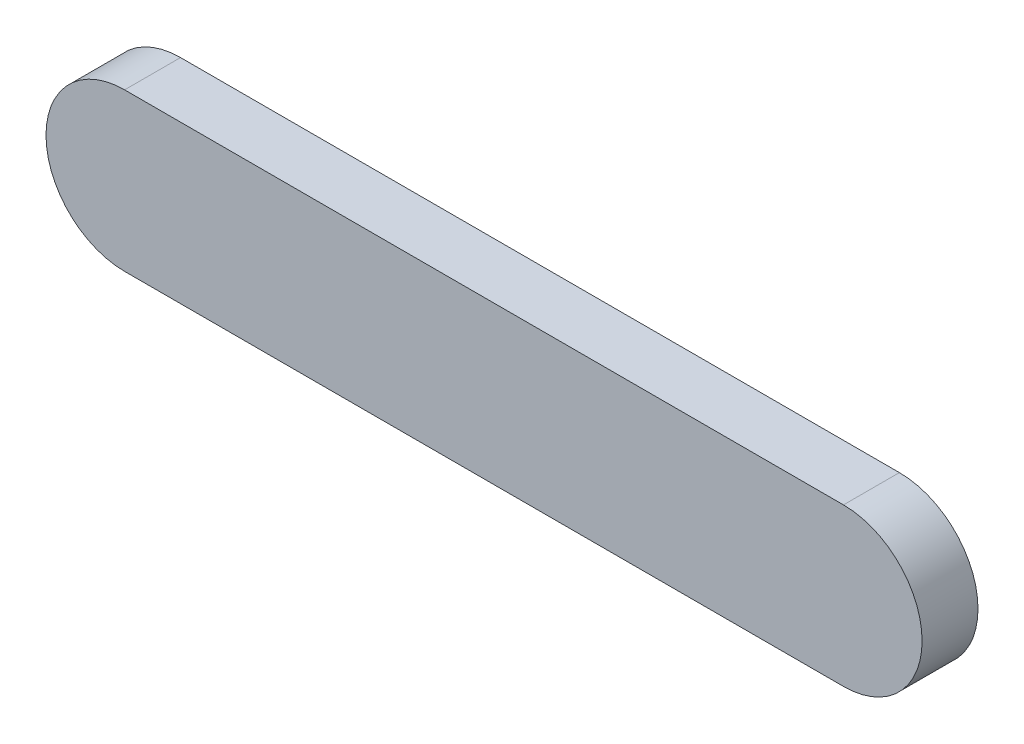
ISO-10303-21;
HEADER;
FILE_DESCRIPTION(('STEP AP214'),'2;1');
FILE_NAME('part.step','',(''),(''),'','','');
FILE_SCHEMA(('AUTOMOTIVE_DESIGN { 1 0 10303 214 1 1 1 1 }'));
ENDSEC;
DATA;
#1=APPLICATION_CONTEXT('core data for automotive mechanical design processes');
#2=APPLICATION_PROTOCOL_DEFINITION('international standard','automotive_design',2000,#1);
#3=PRODUCT_CONTEXT('',#1,'mechanical');
#4=PRODUCT('Part','Part','',(#3));
#5=PRODUCT_RELATED_PRODUCT_CATEGORY('part','',(#4));
#6=PRODUCT_DEFINITION_FORMATION('','',#4);
#7=PRODUCT_DEFINITION_CONTEXT('part definition',#1,'design');
#8=PRODUCT_DEFINITION('design','',#6,#7);
#9=PRODUCT_DEFINITION_SHAPE('','',#8);
#10=(LENGTH_UNIT() NAMED_UNIT(*) SI_UNIT(.MILLI.,.METRE.));
#11=(NAMED_UNIT(*) PLANE_ANGLE_UNIT() SI_UNIT($,.RADIAN.));
#12=(NAMED_UNIT(*) SI_UNIT($,.STERADIAN.) SOLID_ANGLE_UNIT());
#13=UNCERTAINTY_MEASURE_WITH_UNIT(LENGTH_MEASURE(1.E-05),#10,'distance_accuracy_value','');
#14=(GEOMETRIC_REPRESENTATION_CONTEXT(3) GLOBAL_UNCERTAINTY_ASSIGNED_CONTEXT((#13)) GLOBAL_UNIT_ASSIGNED_CONTEXT((#10,
#11,#12)) REPRESENTATION_CONTEXT('',''));
#15=CARTESIAN_POINT('',(0.,0.,0.));
#16=DIRECTION('',(0.,0.,1.));
#17=DIRECTION('',(1.,0.,0.));
#18=AXIS2_PLACEMENT_3D('',#15,#16,#17);
#19=CARTESIAN_POINT('',(-37.9019976077163,107.832873361256,-12.954));
#20=DIRECTION('',(0.,0.,1.));
#21=DIRECTION('',(1.,0.,0.));
#22=AXIS2_PLACEMENT_3D('',#19,#20,#21);
#23=CYLINDRICAL_SURFACE('',#22,25.);
#24=CARTESIAN_POINT('',(-37.9019976077163,107.832873361256,4.826));
#25=DIRECTION('',(0.,0.,1.));
#26=DIRECTION('',(1.,0.,0.));
#27=AXIS2_PLACEMENT_3D('',#24,#25,#26);
#28=CIRCLE('',#27,25.);
#29=CARTESIAN_POINT('',(-37.9019976077163,82.8328733612559,4.826));
#30=VERTEX_POINT('',#29);
#31=CARTESIAN_POINT('',(-37.9019976077163,132.832873361256,4.826));
#32=VERTEX_POINT('',#31);
#33=EDGE_CURVE('E98',#30,#32,#28,.T.);
#34=ORIENTED_EDGE('',*,*,#33,.F.);
#35=DIRECTION('',(0.,0.,1.));
#36=VECTOR('',#35,1.);
#37=CARTESIAN_POINT('',(-37.9019976077163,82.8328733612559,-12.954));
#38=LINE('',#37,#36);
#39=CARTESIAN_POINT('',(-37.9019976077163,82.8328733612559,-12.954));
#40=VERTEX_POINT('',#39);
#41=EDGE_CURVE('E11',#40,#30,#38,.T.);
#42=ORIENTED_EDGE('',*,*,#41,.F.);
#43=CARTESIAN_POINT('',(-37.9019976077163,107.832873361256,-12.954));
#44=DIRECTION('',(0.,0.,1.));
#45=DIRECTION('',(1.,0.,0.));
#46=AXIS2_PLACEMENT_3D('',#43,#44,#45);
#47=CIRCLE('',#46,25.);
#48=CARTESIAN_POINT('',(-37.9019976077163,132.832873361256,-12.954));
#49=VERTEX_POINT('',#48);
#50=EDGE_CURVE('E92',#40,#49,#47,.T.);
#51=ORIENTED_EDGE('',*,*,#50,.T.);
#52=DIRECTION('',(0.,0.,1.));
#53=VECTOR('',#52,1.);
#54=CARTESIAN_POINT('',(-37.9019976077163,132.832873361256,-12.954));
#55=LINE('',#54,#53);
#56=EDGE_CURVE('E37',#49,#32,#55,.T.);
#57=ORIENTED_EDGE('',*,*,#56,.T.);
#58=EDGE_LOOP('',(#34,#42,#51,#57));
#59=FACE_BOUND('',#58,.T.);
#60=ADVANCED_FACE('F34',(#59),#23,.T.);
#61=CARTESIAN_POINT('',(-266.501997607716,82.8328733612559,-12.954));
#62=DIRECTION('',(0.,-1.,0.));
#63=DIRECTION('',(1.,0.,0.));
#64=AXIS2_PLACEMENT_3D('',#61,#62,#63);
#65=PLANE('',#64);
#66=DIRECTION('',(1.,0.,0.));
#67=VECTOR('',#66,1.);
#68=CARTESIAN_POINT('',(-266.501997607716,82.8328733612559,4.826));
#69=LINE('',#68,#67);
#70=CARTESIAN_POINT('',(-266.501997607716,82.8328733612559,4.826));
#71=VERTEX_POINT('',#70);
#72=EDGE_CURVE('E94',#71,#30,#69,.T.);
#73=ORIENTED_EDGE('',*,*,#72,.F.);
#74=DIRECTION('',(0.,0.,1.));
#75=VECTOR('',#74,1.);
#76=CARTESIAN_POINT('',(-266.501997607716,82.8328733612559,-12.954));
#77=LINE('',#76,#75);
#78=CARTESIAN_POINT('',(-266.501997607716,82.8328733612559,-12.954));
#79=VERTEX_POINT('',#78);
#80=EDGE_CURVE('E43',#79,#71,#77,.T.);
#81=ORIENTED_EDGE('',*,*,#80,.F.);
#82=DIRECTION('',(1.,0.,0.));
#83=VECTOR('',#82,1.);
#84=CARTESIAN_POINT('',(-266.501997607716,82.8328733612559,-12.954));
#85=LINE('',#84,#83);
#86=EDGE_CURVE('E89',#79,#40,#85,.T.);
#87=ORIENTED_EDGE('',*,*,#86,.T.);
#88=ORIENTED_EDGE('',*,*,#41,.T.);
#89=EDGE_LOOP('',(#73,#81,#87,#88));
#90=FACE_BOUND('',#89,.T.);
#91=ADVANCED_FACE('F108',(#90),#65,.T.);
#92=CARTESIAN_POINT('',(-266.501997607716,107.832873361256,-12.954));
#93=DIRECTION('',(0.,0.,1.));
#94=DIRECTION('',(1.,0.,0.));
#95=AXIS2_PLACEMENT_3D('',#92,#93,#94);
#96=CYLINDRICAL_SURFACE('',#95,25.);
#97=CARTESIAN_POINT('',(-266.501997607716,107.832873361256,4.826));
#98=DIRECTION('',(0.,0.,1.));
#99=DIRECTION('',(-1.,0.,0.));
#100=AXIS2_PLACEMENT_3D('',#97,#98,#99);
#101=CIRCLE('',#100,25.);
#102=CARTESIAN_POINT('',(-266.501997607716,132.832873361256,4.826));
#103=VERTEX_POINT('',#102);
#104=EDGE_CURVE('E84',#103,#71,#101,.T.);
#105=ORIENTED_EDGE('',*,*,#104,.F.);
#106=DIRECTION('',(0.,0.,1.));
#107=VECTOR('',#106,1.);
#108=CARTESIAN_POINT('',(-266.501997607716,132.832873361256,-12.954));
#109=LINE('',#108,#107);
#110=CARTESIAN_POINT('',(-266.501997607716,132.832873361256,-12.954));
#111=VERTEX_POINT('',#110);
#112=EDGE_CURVE('E79',#111,#103,#109,.T.);
#113=ORIENTED_EDGE('',*,*,#112,.F.);
#114=CARTESIAN_POINT('',(-266.501997607716,107.832873361256,-12.954));
#115=DIRECTION('',(0.,0.,1.));
#116=DIRECTION('',(-1.,0.,0.));
#117=AXIS2_PLACEMENT_3D('',#114,#115,#116);
#118=CIRCLE('',#117,25.);
#119=EDGE_CURVE('E82',#111,#79,#118,.T.);
#120=ORIENTED_EDGE('',*,*,#119,.T.);
#121=ORIENTED_EDGE('',*,*,#80,.T.);
#122=EDGE_LOOP('',(#105,#113,#120,#121));
#123=FACE_BOUND('',#122,.T.);
#124=ADVANCED_FACE('F81',(#123),#96,.T.);
#125=CARTESIAN_POINT('',(-37.9019976077163,132.832873361256,-12.954));
#126=DIRECTION('',(0.,1.,0.));
#127=DIRECTION('',(-1.,0.,0.));
#128=AXIS2_PLACEMENT_3D('',#125,#126,#127);
#129=PLANE('',#128);
#130=DIRECTION('',(-1.,0.,0.));
#131=VECTOR('',#130,1.);
#132=CARTESIAN_POINT('',(-37.9019976077163,132.832873361256,4.826));
#133=LINE('',#132,#131);
#134=EDGE_CURVE('E101',#32,#103,#133,.T.);
#135=ORIENTED_EDGE('',*,*,#134,.F.);
#136=ORIENTED_EDGE('',*,*,#56,.F.);
#137=DIRECTION('',(-1.,0.,0.));
#138=VECTOR('',#137,1.);
#139=CARTESIAN_POINT('',(-37.9019976077163,132.832873361256,-12.954));
#140=LINE('',#139,#138);
#141=EDGE_CURVE('E88',#49,#111,#140,.T.);
#142=ORIENTED_EDGE('',*,*,#141,.T.);
#143=ORIENTED_EDGE('',*,*,#112,.T.);
#144=EDGE_LOOP('',(#135,#136,#142,#143));
#145=FACE_BOUND('',#144,.T.);
#146=ADVANCED_FACE('F91',(#145),#129,.T.);
#147=CARTESIAN_POINT('',(-37.9019976077163,107.832873361256,-12.954));
#148=DIRECTION('',(0.,0.,1.));
#149=DIRECTION('',(1.,0.,0.));
#150=AXIS2_PLACEMENT_3D('',#147,#148,#149);
#151=PLANE('',#150);
#152=ORIENTED_EDGE('',*,*,#50,.F.);
#153=ORIENTED_EDGE('',*,*,#86,.F.);
#154=ORIENTED_EDGE('',*,*,#119,.F.);
#155=ORIENTED_EDGE('',*,*,#141,.F.);
#156=EDGE_LOOP('',(#152,#153,#154,#155));
#157=FACE_BOUND('',#156,.T.);
#158=ADVANCED_FACE('F87',(#157),#151,.F.);
#159=CARTESIAN_POINT('',(-37.9019976077163,107.832873361256,4.826));
#160=DIRECTION('',(0.,0.,1.));
#161=DIRECTION('',(1.,0.,0.));
#162=AXIS2_PLACEMENT_3D('',#159,#160,#161);
#163=PLANE('',#162);
#164=ORIENTED_EDGE('',*,*,#33,.T.);
#165=ORIENTED_EDGE('',*,*,#134,.T.);
#166=ORIENTED_EDGE('',*,*,#104,.T.);
#167=ORIENTED_EDGE('',*,*,#72,.T.);
#168=EDGE_LOOP('',(#164,#165,#166,#167));
#169=FACE_BOUND('',#168,.T.);
#170=ADVANCED_FACE('F107',(#169),#163,.T.);
#171=CLOSED_SHELL('',(#60,#91,#124,#146,#158,#170));
#172=MANIFOLD_SOLID_BREP('B2',#171);
#173=ADVANCED_BREP_SHAPE_REPRESENTATION('',(#18,#172),#14);
#174=SHAPE_DEFINITION_REPRESENTATION(#9,#173);
ENDSEC;
END-ISO-10303-21;
